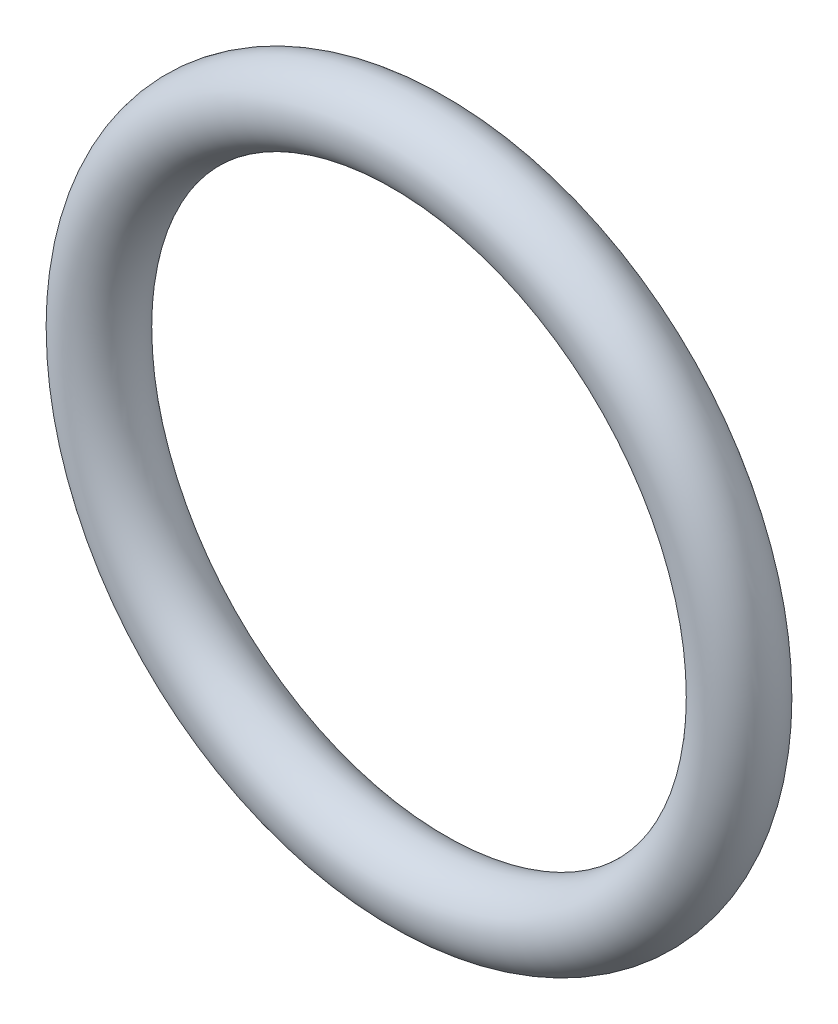
ISO-10303-21;
HEADER;
FILE_DESCRIPTION(('STEP AP214'),'2;1');
FILE_NAME('part.step','',(''),(''),'','','');
FILE_SCHEMA(('AUTOMOTIVE_DESIGN { 1 0 10303 214 1 1 1 1 }'));
ENDSEC;
DATA;
#1=APPLICATION_CONTEXT('core data for automotive mechanical design processes');
#2=APPLICATION_PROTOCOL_DEFINITION('international standard','automotive_design',2000,#1);
#3=PRODUCT_CONTEXT('',#1,'mechanical');
#4=PRODUCT('Part','Part','',(#3));
#5=PRODUCT_RELATED_PRODUCT_CATEGORY('part','',(#4));
#6=PRODUCT_DEFINITION_FORMATION('','',#4);
#7=PRODUCT_DEFINITION_CONTEXT('part definition',#1,'design');
#8=PRODUCT_DEFINITION('design','',#6,#7);
#9=PRODUCT_DEFINITION_SHAPE('','',#8);
#10=(LENGTH_UNIT() NAMED_UNIT(*) SI_UNIT(.MILLI.,.METRE.));
#11=(NAMED_UNIT(*) PLANE_ANGLE_UNIT() SI_UNIT($,.RADIAN.));
#12=(NAMED_UNIT(*) SI_UNIT($,.STERADIAN.) SOLID_ANGLE_UNIT());
#13=UNCERTAINTY_MEASURE_WITH_UNIT(LENGTH_MEASURE(1.E-05),#10,'distance_accuracy_value','');
#14=(GEOMETRIC_REPRESENTATION_CONTEXT(3) GLOBAL_UNCERTAINTY_ASSIGNED_CONTEXT((#13)) GLOBAL_UNIT_ASSIGNED_CONTEXT((#10,
#11,#12)) REPRESENTATION_CONTEXT('',''));
#15=CARTESIAN_POINT('',(0.,0.,0.));
#16=DIRECTION('',(0.,0.,1.));
#17=DIRECTION('',(1.,0.,0.));
#18=AXIS2_PLACEMENT_3D('',#15,#16,#17);
#19=CARTESIAN_POINT('',(0.,0.,0.));
#20=DIRECTION('',(0.,0.,-1.));
#21=DIRECTION('',(-1.,0.,0.));
#22=AXIS2_PLACEMENT_3D('',#19,#20,#21);
#23=TOROIDAL_SURFACE('',#22,10.710965158088,1.25);
#24=CARTESIAN_POINT('',(-11.960965158088,0.,0.));
#25=VERTEX_POINT('',#24);
#26=VERTEX_LOOP('',#25);
#27=FACE_BOUND('',#26,.T.);
#28=ADVANCED_FACE('F66',(#27),#23,.T.);
#29=CLOSED_SHELL('',(#28));
#30=MANIFOLD_SOLID_BREP('B6',#29);
#31=ADVANCED_BREP_SHAPE_REPRESENTATION('',(#18,#30),#14);
#32=SHAPE_DEFINITION_REPRESENTATION(#9,#31);
ENDSEC;
END-ISO-10303-21;
